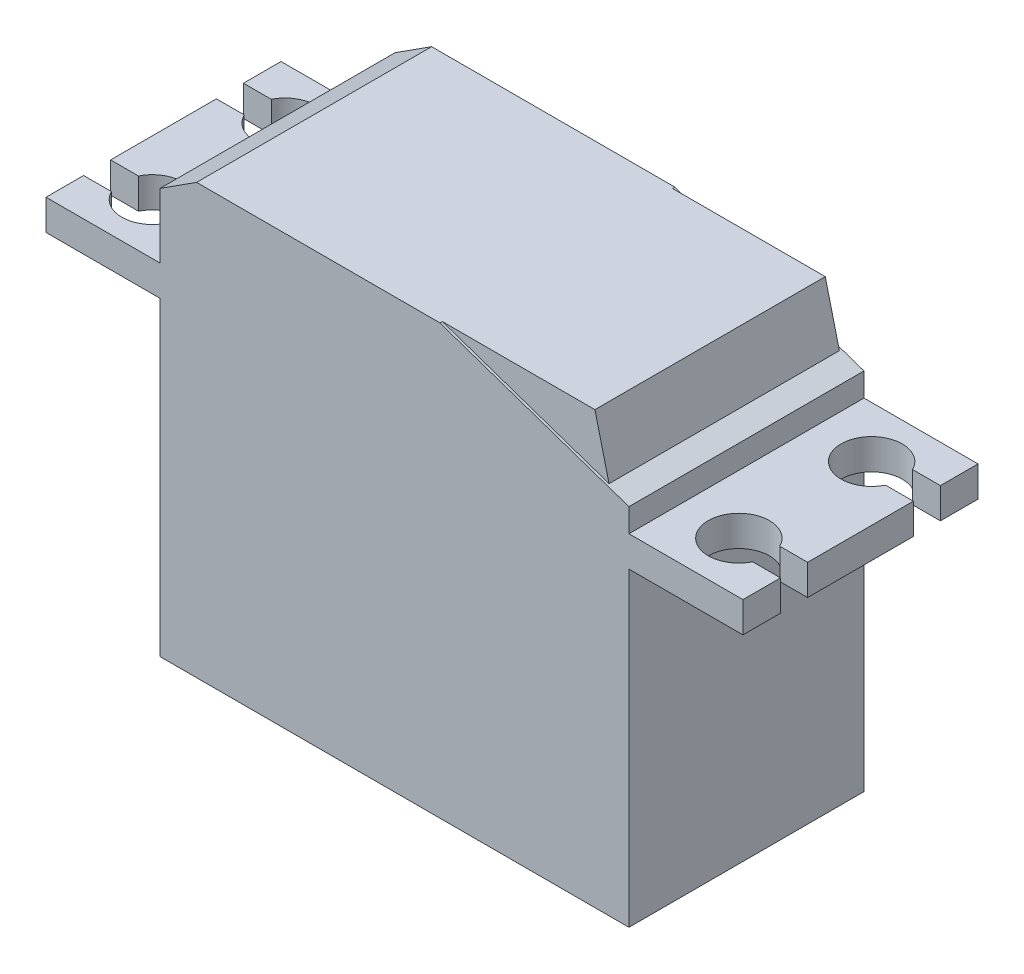
ISO-10303-21;
HEADER;
FILE_DESCRIPTION(('STEP AP214'),'2;1');
FILE_NAME('part.step','',(''),(''),'','','');
FILE_SCHEMA(('AUTOMOTIVE_DESIGN { 1 0 10303 214 1 1 1 1 }'));
ENDSEC;
DATA;
#1=APPLICATION_CONTEXT('core data for automotive mechanical design processes');
#2=APPLICATION_PROTOCOL_DEFINITION('international standard','automotive_design',2000,#1);
#3=PRODUCT_CONTEXT('',#1,'mechanical');
#4=PRODUCT('Part','Part','',(#3));
#5=PRODUCT_RELATED_PRODUCT_CATEGORY('part','',(#4));
#6=PRODUCT_DEFINITION_FORMATION('','',#4);
#7=PRODUCT_DEFINITION_CONTEXT('part definition',#1,'design');
#8=PRODUCT_DEFINITION('design','',#6,#7);
#9=PRODUCT_DEFINITION_SHAPE('','',#8);
#10=(LENGTH_UNIT() NAMED_UNIT(*) SI_UNIT(.MILLI.,.METRE.));
#11=(NAMED_UNIT(*) PLANE_ANGLE_UNIT() SI_UNIT($,.RADIAN.));
#12=(NAMED_UNIT(*) SI_UNIT($,.STERADIAN.) SOLID_ANGLE_UNIT());
#13=UNCERTAINTY_MEASURE_WITH_UNIT(LENGTH_MEASURE(1.E-05),#10,'distance_accuracy_value','');
#14=(GEOMETRIC_REPRESENTATION_CONTEXT(3) GLOBAL_UNCERTAINTY_ASSIGNED_CONTEXT((#13)) GLOBAL_UNIT_ASSIGNED_CONTEXT((#10,
#11,#12)) REPRESENTATION_CONTEXT('',''));
#15=CARTESIAN_POINT('',(0.,0.,0.));
#16=DIRECTION('',(0.,0.,1.));
#17=DIRECTION('',(1.,0.,0.));
#18=AXIS2_PLACEMENT_3D('',#15,#16,#17);
#19=CARTESIAN_POINT('',(-29.65,10.75,10.));
#20=DIRECTION('',(0.,1.,0.));
#21=DIRECTION('',(0.,0.,1.));
#22=AXIS2_PLACEMENT_3D('',#19,#20,#21);
#23=PLANE('',#22);
#24=DIRECTION('',(0.,0.,1.));
#25=VECTOR('',#24,1.);
#26=CARTESIAN_POINT('',(-29.65,10.75,10.));
#27=LINE('',#26,#25);
#28=CARTESIAN_POINT('',(-29.65,10.75,-10.));
#29=VERTEX_POINT('',#28);
#30=CARTESIAN_POINT('',(-29.65,10.75,-6.8));
#31=VERTEX_POINT('',#30);
#32=EDGE_CURVE('E271',#29,#31,#27,.T.);
#33=ORIENTED_EDGE('',*,*,#32,.T.);
#34=DIRECTION('',(1.,0.,0.));
#35=VECTOR('',#34,1.);
#36=CARTESIAN_POINT('',(-29.65,10.75,-6.8));
#37=LINE('',#36,#35);
#38=CARTESIAN_POINT('',(-27.2818447632722,10.75,-6.8));
#39=VERTEX_POINT('',#38);
#40=EDGE_CURVE('E256',#31,#39,#37,.T.);
#41=ORIENTED_EDGE('',*,*,#40,.T.);
#42=CARTESIAN_POINT('',(-24.95,10.75,-5.65));
#43=DIRECTION('',(0.,-1.,0.));
#44=DIRECTION('',(0.,0.,1.));
#45=AXIS2_PLACEMENT_3D('',#42,#43,#44);
#46=CIRCLE('',#45,2.6);
#47=CARTESIAN_POINT('',(-27.2818447632722,10.75,-4.5));
#48=VERTEX_POINT('',#47);
#49=EDGE_CURVE('E265',#39,#48,#46,.T.);
#50=ORIENTED_EDGE('',*,*,#49,.T.);
#51=DIRECTION('',(-1.,0.,0.));
#52=VECTOR('',#51,1.);
#53=CARTESIAN_POINT('',(-29.65,10.75,-4.5));
#54=LINE('',#53,#52);
#55=CARTESIAN_POINT('',(-29.65,10.75,-4.5));
#56=VERTEX_POINT('',#55);
#57=EDGE_CURVE('E249',#48,#56,#54,.T.);
#58=ORIENTED_EDGE('',*,*,#57,.T.);
#59=CARTESIAN_POINT('',(-29.65,10.75,4.5));
#60=VERTEX_POINT('',#59);
#61=EDGE_CURVE('E261',#56,#60,#27,.T.);
#62=ORIENTED_EDGE('',*,*,#61,.T.);
#63=DIRECTION('',(1.,0.,0.));
#64=VECTOR('',#63,1.);
#65=CARTESIAN_POINT('',(-29.65,10.75,4.5));
#66=LINE('',#65,#64);
#67=CARTESIAN_POINT('',(-27.2818447632722,10.75,4.5));
#68=VERTEX_POINT('',#67);
#69=EDGE_CURVE('E594',#60,#68,#66,.T.);
#70=ORIENTED_EDGE('',*,*,#69,.T.);
#71=CARTESIAN_POINT('',(-24.95,10.75,5.65));
#72=DIRECTION('',(0.,-1.,0.));
#73=DIRECTION('',(0.,0.,-1.));
#74=AXIS2_PLACEMENT_3D('',#71,#72,#73);
#75=CIRCLE('',#74,2.6);
#76=CARTESIAN_POINT('',(-27.2818447632722,10.75,6.8));
#77=VERTEX_POINT('',#76);
#78=EDGE_CURVE('E598',#68,#77,#75,.T.);
#79=ORIENTED_EDGE('',*,*,#78,.T.);
#80=DIRECTION('',(-1.,0.,0.));
#81=VECTOR('',#80,1.);
#82=CARTESIAN_POINT('',(-29.65,10.75,6.8));
#83=LINE('',#82,#81);
#84=CARTESIAN_POINT('',(-29.65,10.75,6.8));
#85=VERTEX_POINT('',#84);
#86=EDGE_CURVE('E601',#77,#85,#83,.T.);
#87=ORIENTED_EDGE('',*,*,#86,.T.);
#88=CARTESIAN_POINT('',(-29.65,10.75,10.));
#89=VERTEX_POINT('',#88);
#90=EDGE_CURVE('E272',#85,#89,#27,.T.);
#91=ORIENTED_EDGE('',*,*,#90,.T.);
#92=DIRECTION('',(1.,0.,0.));
#93=VECTOR('',#92,1.);
#94=CARTESIAN_POINT('',(-29.65,10.75,10.));
#95=LINE('',#94,#93);
#96=CARTESIAN_POINT('',(-19.95,10.75,10.));
#97=VERTEX_POINT('',#96);
#98=EDGE_CURVE('E300',#89,#97,#95,.T.);
#99=ORIENTED_EDGE('',*,*,#98,.T.);
#100=DIRECTION('',(0.,0.,1.));
#101=VECTOR('',#100,1.);
#102=CARTESIAN_POINT('',(-19.95,10.75,10.));
#103=LINE('',#102,#101);
#104=CARTESIAN_POINT('',(-19.95,10.75,-10.));
#105=VERTEX_POINT('',#104);
#106=EDGE_CURVE('E292',#105,#97,#103,.T.);
#107=ORIENTED_EDGE('',*,*,#106,.F.);
#108=DIRECTION('',(1.,0.,0.));
#109=VECTOR('',#108,1.);
#110=CARTESIAN_POINT('',(-29.65,10.75,-10.));
#111=LINE('',#110,#109);
#112=EDGE_CURVE('E303',#29,#105,#111,.T.);
#113=ORIENTED_EDGE('',*,*,#112,.F.);
#114=EDGE_LOOP('',(#33,#41,#50,#58,#62,#70,#79,#87,#91,#99,#107,#113));
#115=FACE_BOUND('',#114,.T.);
#116=ADVANCED_FACE('F32',(#115),#23,.T.);
#117=CARTESIAN_POINT('',(-29.65,8.15,10.));
#118=DIRECTION('',(0.,-1.,0.));
#119=DIRECTION('',(0.,0.,-1.));
#120=AXIS2_PLACEMENT_3D('',#117,#118,#119);
#121=PLANE('',#120);
#122=CARTESIAN_POINT('',(-24.95,8.15,-5.65));
#123=DIRECTION('',(0.,-1.,0.));
#124=DIRECTION('',(0.,0.,-1.));
#125=AXIS2_PLACEMENT_3D('',#122,#123,#124);
#126=CIRCLE('',#125,2.6);
#127=CARTESIAN_POINT('',(-27.2818447632722,8.15,-6.8));
#128=VERTEX_POINT('',#127);
#129=CARTESIAN_POINT('',(-27.2818447632722,8.15,-4.5));
#130=VERTEX_POINT('',#129);
#131=EDGE_CURVE('E618',#128,#130,#126,.T.);
#132=ORIENTED_EDGE('',*,*,#131,.F.);
#133=DIRECTION('',(1.,0.,0.));
#134=VECTOR('',#133,1.);
#135=CARTESIAN_POINT('',(-29.65,8.15,-6.8));
#136=LINE('',#135,#134);
#137=CARTESIAN_POINT('',(-29.65,8.15,-6.8));
#138=VERTEX_POINT('',#137);
#139=EDGE_CURVE('E266',#138,#128,#136,.T.);
#140=ORIENTED_EDGE('',*,*,#139,.F.);
#141=DIRECTION('',(0.,0.,-1.));
#142=VECTOR('',#141,1.);
#143=CARTESIAN_POINT('',(-29.65,8.15,10.));
#144=LINE('',#143,#142);
#145=CARTESIAN_POINT('',(-29.65,8.15,-10.));
#146=VERTEX_POINT('',#145);
#147=EDGE_CURVE('E281',#138,#146,#144,.T.);
#148=ORIENTED_EDGE('',*,*,#147,.T.);
#149=DIRECTION('',(1.,0.,0.));
#150=VECTOR('',#149,1.);
#151=CARTESIAN_POINT('',(-29.65,8.15,-10.));
#152=LINE('',#151,#150);
#153=CARTESIAN_POINT('',(-19.95,8.15,-10.));
#154=VERTEX_POINT('',#153);
#155=EDGE_CURVE('E307',#146,#154,#152,.T.);
#156=ORIENTED_EDGE('',*,*,#155,.T.);
#157=DIRECTION('',(0.,0.,-1.));
#158=VECTOR('',#157,1.);
#159=CARTESIAN_POINT('',(-19.95,8.15,10.));
#160=LINE('',#159,#158);
#161=CARTESIAN_POINT('',(-19.95,8.15,10.));
#162=VERTEX_POINT('',#161);
#163=EDGE_CURVE('E296',#162,#154,#160,.T.);
#164=ORIENTED_EDGE('',*,*,#163,.F.);
#165=DIRECTION('',(1.,0.,0.));
#166=VECTOR('',#165,1.);
#167=CARTESIAN_POINT('',(-29.65,8.15,10.));
#168=LINE('',#167,#166);
#169=CARTESIAN_POINT('',(-29.65,8.15,10.));
#170=VERTEX_POINT('',#169);
#171=EDGE_CURVE('E285',#170,#162,#168,.T.);
#172=ORIENTED_EDGE('',*,*,#171,.F.);
#173=CARTESIAN_POINT('',(-29.65,8.15,6.8));
#174=VERTEX_POINT('',#173);
#175=EDGE_CURVE('E282',#170,#174,#144,.T.);
#176=ORIENTED_EDGE('',*,*,#175,.T.);
#177=DIRECTION('',(-1.,0.,0.));
#178=VECTOR('',#177,1.);
#179=CARTESIAN_POINT('',(-29.65,8.15,6.8));
#180=LINE('',#179,#178);
#181=CARTESIAN_POINT('',(-27.2818447632722,8.15,6.8));
#182=VERTEX_POINT('',#181);
#183=EDGE_CURVE('E57',#182,#174,#180,.T.);
#184=ORIENTED_EDGE('',*,*,#183,.F.);
#185=CARTESIAN_POINT('',(-24.95,8.15,5.65));
#186=DIRECTION('',(0.,-1.,0.));
#187=DIRECTION('',(0.,0.,-1.));
#188=AXIS2_PLACEMENT_3D('',#185,#186,#187);
#189=CIRCLE('',#188,2.6);
#190=CARTESIAN_POINT('',(-27.2818447632722,8.15,4.5));
#191=VERTEX_POINT('',#190);
#192=EDGE_CURVE('E588',#191,#182,#189,.T.);
#193=ORIENTED_EDGE('',*,*,#192,.F.);
#194=DIRECTION('',(1.,0.,0.));
#195=VECTOR('',#194,1.);
#196=CARTESIAN_POINT('',(-29.65,8.15,4.5));
#197=LINE('',#196,#195);
#198=CARTESIAN_POINT('',(-29.65,8.15,4.5));
#199=VERTEX_POINT('',#198);
#200=EDGE_CURVE('E603',#199,#191,#197,.T.);
#201=ORIENTED_EDGE('',*,*,#200,.F.);
#202=CARTESIAN_POINT('',(-29.65,8.15,-4.5));
#203=VERTEX_POINT('',#202);
#204=EDGE_CURVE('E286',#199,#203,#144,.T.);
#205=ORIENTED_EDGE('',*,*,#204,.T.);
#206=DIRECTION('',(-1.,0.,0.));
#207=VECTOR('',#206,1.);
#208=CARTESIAN_POINT('',(-29.65,8.15,-4.5));
#209=LINE('',#208,#207);
#210=EDGE_CURVE('E49',#130,#203,#209,.T.);
#211=ORIENTED_EDGE('',*,*,#210,.F.);
#212=EDGE_LOOP('',(#132,#140,#148,#156,#164,#172,#176,#184,#193,#201,#205,#211));
#213=FACE_BOUND('',#212,.T.);
#214=ADVANCED_FACE('F328',(#213),#121,.T.);
#215=CARTESIAN_POINT('',(-29.65,0.,0.));
#216=DIRECTION('',(-1.,0.,0.));
#217=DIRECTION('',(0.,0.,-1.));
#218=AXIS2_PLACEMENT_3D('',#215,#216,#217);
#219=PLANE('',#218);
#220=ORIENTED_EDGE('',*,*,#147,.F.);
#221=DIRECTION('',(0.,1.,0.));
#222=VECTOR('',#221,1.);
#223=CARTESIAN_POINT('',(-29.65,-18.251025,-6.8));
#224=LINE('',#223,#222);
#225=EDGE_CURVE('E607',#138,#31,#224,.T.);
#226=ORIENTED_EDGE('',*,*,#225,.T.);
#227=ORIENTED_EDGE('',*,*,#32,.F.);
#228=DIRECTION('',(0.,1.,0.));
#229=VECTOR('',#228,1.);
#230=CARTESIAN_POINT('',(-29.65,10.75,-10.));
#231=LINE('',#230,#229);
#232=EDGE_CURVE('E274',#146,#29,#231,.T.);
#233=ORIENTED_EDGE('',*,*,#232,.F.);
#234=EDGE_LOOP('',(#220,#226,#227,#233));
#235=FACE_BOUND('',#234,.T.);
#236=ADVANCED_FACE('F626',(#235),#219,.T.);
#237=ORIENTED_EDGE('',*,*,#61,.F.);
#238=DIRECTION('',(0.,1.,0.));
#239=VECTOR('',#238,1.);
#240=CARTESIAN_POINT('',(-29.65,-18.251025,-4.5));
#241=LINE('',#240,#239);
#242=EDGE_CURVE('E246',#203,#56,#241,.T.);
#243=ORIENTED_EDGE('',*,*,#242,.F.);
#244=ORIENTED_EDGE('',*,*,#204,.F.);
#245=DIRECTION('',(0.,1.,0.));
#246=VECTOR('',#245,1.);
#247=CARTESIAN_POINT('',(-29.65,-18.251025,4.5));
#248=LINE('',#247,#246);
#249=EDGE_CURVE('E270',#199,#60,#248,.T.);
#250=ORIENTED_EDGE('',*,*,#249,.T.);
#251=EDGE_LOOP('',(#237,#243,#244,#250));
#252=FACE_BOUND('',#251,.T.);
#253=ADVANCED_FACE('F269',(#252),#219,.T.);
#254=ORIENTED_EDGE('',*,*,#90,.F.);
#255=DIRECTION('',(0.,1.,0.));
#256=VECTOR('',#255,1.);
#257=CARTESIAN_POINT('',(-29.65,-18.251025,6.8));
#258=LINE('',#257,#256);
#259=EDGE_CURVE('E584',#174,#85,#258,.T.);
#260=ORIENTED_EDGE('',*,*,#259,.F.);
#261=ORIENTED_EDGE('',*,*,#175,.F.);
#262=DIRECTION('',(0.,-1.,0.));
#263=VECTOR('',#262,1.);
#264=CARTESIAN_POINT('',(-29.65,10.75,10.));
#265=LINE('',#264,#263);
#266=EDGE_CURVE('E275',#89,#170,#265,.T.);
#267=ORIENTED_EDGE('',*,*,#266,.F.);
#268=EDGE_LOOP('',(#254,#260,#261,#267));
#269=FACE_BOUND('',#268,.T.);
#270=ADVANCED_FACE('F583',(#269),#219,.T.);
#271=CARTESIAN_POINT('',(-19.95,18.25,-10.));
#272=DIRECTION('',(1.,0.,0.));
#273=DIRECTION('',(0.,0.,-1.));
#274=AXIS2_PLACEMENT_3D('',#271,#272,#273);
#275=PLANE('',#274);
#276=DIRECTION('',(0.,-1.,0.));
#277=VECTOR('',#276,1.);
#278=CARTESIAN_POINT('',(-19.95,18.25,10.));
#279=LINE('',#278,#277);
#280=CARTESIAN_POINT('',(-19.95,-18.25,10.));
#281=VERTEX_POINT('',#280);
#282=EDGE_CURVE('E321',#162,#281,#279,.T.);
#283=ORIENTED_EDGE('',*,*,#282,.F.);
#284=ORIENTED_EDGE('',*,*,#163,.T.);
#285=DIRECTION('',(0.,-1.,0.));
#286=VECTOR('',#285,1.);
#287=CARTESIAN_POINT('',(-19.95,18.25,-10.));
#288=LINE('',#287,#286);
#289=CARTESIAN_POINT('',(-19.95,-18.25,-10.));
#290=VERTEX_POINT('',#289);
#291=EDGE_CURVE('E297',#154,#290,#288,.T.);
#292=ORIENTED_EDGE('',*,*,#291,.T.);
#293=DIRECTION('',(0.,0.,1.));
#294=VECTOR('',#293,1.);
#295=CARTESIAN_POINT('',(-19.95,-18.25,-10.));
#296=LINE('',#295,#294);
#297=EDGE_CURVE('E334',#290,#281,#296,.T.);
#298=ORIENTED_EDGE('',*,*,#297,.T.);
#299=EDGE_LOOP('',(#283,#284,#292,#298));
#300=FACE_BOUND('',#299,.T.);
#301=ADVANCED_FACE('F332',(#300),#275,.F.);
#302=CARTESIAN_POINT('',(16.8538354227075,18.25,-9.8));
#303=DIRECTION('',(0.970588235294116,0.24074566976096,0.));
#304=DIRECTION('',(-0.24074566976096,0.970588235294116,0.));
#305=AXIS2_PLACEMENT_3D('',#302,#303,#304);
#306=PLANE('',#305);
#307=DIRECTION('',(0.,0.,1.));
#308=VECTOR('',#307,1.);
#309=CARTESIAN_POINT('',(16.8538354227075,18.25,-9.8));
#310=LINE('',#309,#308);
#311=CARTESIAN_POINT('',(16.8538354227075,18.25,-9.8));
#312=VERTEX_POINT('',#311);
#313=CARTESIAN_POINT('',(16.8538354227075,18.25,9.8));
#314=VERTEX_POINT('',#313);
#315=EDGE_CURVE('E489',#312,#314,#310,.T.);
#316=ORIENTED_EDGE('',*,*,#315,.T.);
#317=DIRECTION('',(-0.24074566976096,0.970588235294116,0.));
#318=VECTOR('',#317,1.);
#319=CARTESIAN_POINT('',(18.0575637715123,13.3970588235294,9.8));
#320=LINE('',#319,#318);
#321=CARTESIAN_POINT('',(18.0575637715123,13.3970588235294,9.79999999999999));
#322=VERTEX_POINT('',#321);
#323=EDGE_CURVE('E571',#322,#314,#320,.T.);
#324=ORIENTED_EDGE('',*,*,#323,.F.);
#325=DIRECTION('',(0.,0.,1.));
#326=VECTOR('',#325,1.);
#327=CARTESIAN_POINT('',(18.0575637715123,13.3970588235294,-9.8));
#328=LINE('',#327,#326);
#329=CARTESIAN_POINT('',(18.0575637715123,13.3970588235294,-9.8));
#330=VERTEX_POINT('',#329);
#331=EDGE_CURVE('E488',#330,#322,#328,.T.);
#332=ORIENTED_EDGE('',*,*,#331,.F.);
#333=DIRECTION('',(-0.24074566976096,0.970588235294116,0.));
#334=VECTOR('',#333,1.);
#335=CARTESIAN_POINT('',(16.8538354227075,18.25,-9.8));
#336=LINE('',#335,#334);
#337=EDGE_CURVE('E482',#330,#312,#336,.T.);
#338=ORIENTED_EDGE('',*,*,#337,.T.);
#339=EDGE_LOOP('',(#316,#324,#332,#338));
#340=FACE_BOUND('',#339,.T.);
#341=ADVANCED_FACE('F679',(#340),#306,.T.);
#342=CARTESIAN_POINT('',(29.65,0.,0.));
#343=DIRECTION('',(1.,0.,0.));
#344=DIRECTION('',(0.,0.,-1.));
#345=AXIS2_PLACEMENT_3D('',#342,#343,#344);
#346=PLANE('',#345);
#347=DIRECTION('',(0.,1.,0.));
#348=VECTOR('',#347,1.);
#349=CARTESIAN_POINT('',(29.65,-18.251025,-4.5));
#350=LINE('',#349,#348);
#351=CARTESIAN_POINT('',(29.65,8.15,-4.5));
#352=VERTEX_POINT('',#351);
#353=CARTESIAN_POINT('',(29.65,10.75,-4.5));
#354=VERTEX_POINT('',#353);
#355=EDGE_CURVE('E452',#352,#354,#350,.T.);
#356=ORIENTED_EDGE('',*,*,#355,.T.);
#357=DIRECTION('',(0.,0.,1.));
#358=VECTOR('',#357,1.);
#359=CARTESIAN_POINT('',(29.65,10.75,10.));
#360=LINE('',#359,#358);
#361=CARTESIAN_POINT('',(29.65,10.75,4.5));
#362=VERTEX_POINT('',#361);
#363=EDGE_CURVE('E388',#354,#362,#360,.T.);
#364=ORIENTED_EDGE('',*,*,#363,.T.);
#365=DIRECTION('',(0.,1.,0.));
#366=VECTOR('',#365,1.);
#367=CARTESIAN_POINT('',(29.65,-18.251025,4.5));
#368=LINE('',#367,#366);
#369=CARTESIAN_POINT('',(29.65,8.15,4.5));
#370=VERTEX_POINT('',#369);
#371=EDGE_CURVE('E450',#370,#362,#368,.T.);
#372=ORIENTED_EDGE('',*,*,#371,.F.);
#373=DIRECTION('',(0.,0.,-1.));
#374=VECTOR('',#373,1.);
#375=CARTESIAN_POINT('',(29.65,8.15,10.));
#376=LINE('',#375,#374);
#377=EDGE_CURVE('E381',#370,#352,#376,.T.);
#378=ORIENTED_EDGE('',*,*,#377,.T.);
#379=EDGE_LOOP('',(#356,#364,#372,#378));
#380=FACE_BOUND('',#379,.T.);
#381=ADVANCED_FACE('F448',(#380),#346,.T.);
#382=DIRECTION('',(0.,1.,0.));
#383=VECTOR('',#382,1.);
#384=CARTESIAN_POINT('',(29.65,-18.251025,6.8));
#385=LINE('',#384,#383);
#386=CARTESIAN_POINT('',(29.65,8.15,6.8));
#387=VERTEX_POINT('',#386);
#388=CARTESIAN_POINT('',(29.65,10.75,6.8));
#389=VERTEX_POINT('',#388);
#390=EDGE_CURVE('E474',#387,#389,#385,.T.);
#391=ORIENTED_EDGE('',*,*,#390,.T.);
#392=CARTESIAN_POINT('',(29.65,10.75,10.));
#393=VERTEX_POINT('',#392);
#394=EDGE_CURVE('E383',#389,#393,#360,.T.);
#395=ORIENTED_EDGE('',*,*,#394,.T.);
#396=DIRECTION('',(0.,-1.,0.));
#397=VECTOR('',#396,1.);
#398=CARTESIAN_POINT('',(29.65,10.75,10.));
#399=LINE('',#398,#397);
#400=CARTESIAN_POINT('',(29.65,8.15,10.));
#401=VERTEX_POINT('',#400);
#402=EDGE_CURVE('E372',#393,#401,#399,.T.);
#403=ORIENTED_EDGE('',*,*,#402,.T.);
#404=EDGE_CURVE('E377',#401,#387,#376,.T.);
#405=ORIENTED_EDGE('',*,*,#404,.T.);
#406=EDGE_LOOP('',(#391,#395,#403,#405));
#407=FACE_BOUND('',#406,.T.);
#408=ADVANCED_FACE('F687',(#407),#346,.T.);
#409=CARTESIAN_POINT('',(19.95,18.25,-10.));
#410=DIRECTION('',(-1.,0.,0.));
#411=DIRECTION('',(0.,0.,1.));
#412=AXIS2_PLACEMENT_3D('',#409,#410,#411);
#413=PLANE('',#412);
#414=DIRECTION('',(0.,-1.,0.));
#415=VECTOR('',#414,1.);
#416=CARTESIAN_POINT('',(19.95,18.25,-10.));
#417=LINE('',#416,#415);
#418=CARTESIAN_POINT('',(19.95,12.75,-10.));
#419=VERTEX_POINT('',#418);
#420=CARTESIAN_POINT('',(19.95,10.75,-10.));
#421=VERTEX_POINT('',#420);
#422=EDGE_CURVE('E41',#419,#421,#417,.T.);
#423=ORIENTED_EDGE('',*,*,#422,.F.);
#424=DIRECTION('',(0.,0.,1.));
#425=VECTOR('',#424,1.);
#426=CARTESIAN_POINT('',(19.95,12.75,-10.00005));
#427=LINE('',#426,#425);
#428=CARTESIAN_POINT('',(19.95,12.75,10.));
#429=VERTEX_POINT('',#428);
#430=EDGE_CURVE('E370',#419,#429,#427,.T.);
#431=ORIENTED_EDGE('',*,*,#430,.T.);
#432=DIRECTION('',(0.,-1.,0.));
#433=VECTOR('',#432,1.);
#434=CARTESIAN_POINT('',(19.95,18.25,10.));
#435=LINE('',#434,#433);
#436=CARTESIAN_POINT('',(19.95,10.75,10.));
#437=VERTEX_POINT('',#436);
#438=EDGE_CURVE('E337',#429,#437,#435,.T.);
#439=ORIENTED_EDGE('',*,*,#438,.T.);
#440=DIRECTION('',(0.,0.,1.));
#441=VECTOR('',#440,1.);
#442=CARTESIAN_POINT('',(19.95,10.75,10.));
#443=LINE('',#442,#441);
#444=EDGE_CURVE('E376',#421,#437,#443,.T.);
#445=ORIENTED_EDGE('',*,*,#444,.F.);
#446=EDGE_LOOP('',(#423,#431,#439,#445));
#447=FACE_BOUND('',#446,.T.);
#448=ADVANCED_FACE('F34',(#447),#413,.F.);
#449=DIRECTION('',(0.,0.,-1.));
#450=VECTOR('',#449,1.);
#451=CARTESIAN_POINT('',(19.95,8.15,10.));
#452=LINE('',#451,#450);
#453=CARTESIAN_POINT('',(19.95,8.15,10.));
#454=VERTEX_POINT('',#453);
#455=CARTESIAN_POINT('',(19.95,8.15,-10.));
#456=VERTEX_POINT('',#455);
#457=EDGE_CURVE('E369',#454,#456,#452,.T.);
#458=ORIENTED_EDGE('',*,*,#457,.F.);
#459=CARTESIAN_POINT('',(19.95,-18.25,10.));
#460=VERTEX_POINT('',#459);
#461=EDGE_CURVE('E341',#454,#460,#435,.T.);
#462=ORIENTED_EDGE('',*,*,#461,.T.);
#463=DIRECTION('',(0.,0.,-1.));
#464=VECTOR('',#463,1.);
#465=CARTESIAN_POINT('',(19.95,-18.25,-10.));
#466=LINE('',#465,#464);
#467=CARTESIAN_POINT('',(19.95,-18.25,-10.));
#468=VERTEX_POINT('',#467);
#469=EDGE_CURVE('E405',#460,#468,#466,.T.);
#470=ORIENTED_EDGE('',*,*,#469,.T.);
#471=EDGE_CURVE('E356',#456,#468,#417,.T.);
#472=ORIENTED_EDGE('',*,*,#471,.F.);
#473=EDGE_LOOP('',(#458,#462,#470,#472));
#474=FACE_BOUND('',#473,.T.);
#475=ADVANCED_FACE('F552',(#474),#413,.F.);
#476=CARTESIAN_POINT('',(-19.95,18.25,-10.));
#477=DIRECTION('',(0.,0.,1.));
#478=DIRECTION('',(1.,0.,0.));
#479=AXIS2_PLACEMENT_3D('',#476,#477,#478);
#480=PLANE('',#479);
#481=CARTESIAN_POINT('',(-19.95,16.25,-10.));
#482=VERTEX_POINT('',#481);
#483=EDGE_CURVE('E345',#482,#105,#288,.T.);
#484=ORIENTED_EDGE('',*,*,#483,.F.);
#485=DIRECTION('',(-0.841317968447209,-0.540540540540541,0.));
#486=VECTOR('',#485,1.);
#487=CARTESIAN_POINT('',(-16.8371235167453,18.25,-10.));
#488=LINE('',#487,#486);
#489=CARTESIAN_POINT('',(-16.8371235167453,18.25,-10.));
#490=VERTEX_POINT('',#489);
#491=EDGE_CURVE('E302',#490,#482,#488,.T.);
#492=ORIENTED_EDGE('',*,*,#491,.F.);
#493=DIRECTION('',(-1.,0.,0.));
#494=VECTOR('',#493,1.);
#495=CARTESIAN_POINT('',(-19.95,18.25,-10.));
#496=LINE('',#495,#494);
#497=CARTESIAN_POINT('',(3.86429205785458,18.25,-10.0000025));
#498=VERTEX_POINT('',#497);
#499=EDGE_CURVE('E559',#498,#490,#496,.T.);
#500=ORIENTED_EDGE('',*,*,#499,.F.);
#501=DIRECTION('',(0.946218114243848,-0.323529411764706,0.));
#502=VECTOR('',#501,1.);
#503=CARTESIAN_POINT('',(-17.4573275614183,25.5402546986291,-10.));
#504=LINE('',#503,#502);
#505=EDGE_CURVE('E365',#498,#419,#504,.T.);
#506=ORIENTED_EDGE('',*,*,#505,.T.);
#507=ORIENTED_EDGE('',*,*,#422,.T.);
#508=DIRECTION('',(-1.,0.,0.));
#509=VECTOR('',#508,1.);
#510=CARTESIAN_POINT('',(29.65,10.75,-10.));
#511=LINE('',#510,#509);
#512=CARTESIAN_POINT('',(29.65,10.75,-10.));
#513=VERTEX_POINT('',#512);
#514=EDGE_CURVE('E400',#513,#421,#511,.T.);
#515=ORIENTED_EDGE('',*,*,#514,.F.);
#516=DIRECTION('',(0.,1.,0.));
#517=VECTOR('',#516,1.);
#518=CARTESIAN_POINT('',(29.65,10.75,-10.));
#519=LINE('',#518,#517);
#520=CARTESIAN_POINT('',(29.65,8.15,-10.));
#521=VERTEX_POINT('',#520);
#522=EDGE_CURVE('E380',#521,#513,#519,.T.);
#523=ORIENTED_EDGE('',*,*,#522,.F.);
#524=DIRECTION('',(-1.,0.,0.));
#525=VECTOR('',#524,1.);
#526=CARTESIAN_POINT('',(29.65,8.15,-10.));
#527=LINE('',#526,#525);
#528=EDGE_CURVE('E396',#521,#456,#527,.T.);
#529=ORIENTED_EDGE('',*,*,#528,.T.);
#530=ORIENTED_EDGE('',*,*,#471,.T.);
#531=DIRECTION('',(-1.,0.,0.));
#532=VECTOR('',#531,1.);
#533=CARTESIAN_POINT('',(-19.95,-18.25,-10.));
#534=LINE('',#533,#532);
#535=EDGE_CURVE('E545',#468,#290,#534,.T.);
#536=ORIENTED_EDGE('',*,*,#535,.T.);
#537=ORIENTED_EDGE('',*,*,#291,.F.);
#538=ORIENTED_EDGE('',*,*,#155,.F.);
#539=ORIENTED_EDGE('',*,*,#232,.T.);
#540=ORIENTED_EDGE('',*,*,#112,.T.);
#541=EDGE_LOOP('',(#484,#492,#500,#506,#507,#515,#523,#529,#530,#536,#537,#538,#539,#540));
#542=FACE_BOUND('',#541,.T.);
#543=ADVANCED_FACE('F427',(#542),#480,.F.);
#544=ORIENTED_EDGE('',*,*,#483,.T.);
#545=ORIENTED_EDGE('',*,*,#106,.T.);
#546=CARTESIAN_POINT('',(-19.95,16.25,10.));
#547=VERTEX_POINT('',#546);
#548=EDGE_CURVE('E336',#547,#97,#279,.T.);
#549=ORIENTED_EDGE('',*,*,#548,.F.);
#550=DIRECTION('',(0.,0.,-1.));
#551=VECTOR('',#550,1.);
#552=CARTESIAN_POINT('',(-19.95,16.25,10.00105));
#553=LINE('',#552,#551);
#554=EDGE_CURVE('E572',#547,#482,#553,.T.);
#555=ORIENTED_EDGE('',*,*,#554,.T.);
#556=EDGE_LOOP('',(#544,#545,#549,#555));
#557=FACE_BOUND('',#556,.T.);
#558=ADVANCED_FACE('F577',(#557),#275,.F.);
#559=CARTESIAN_POINT('',(-19.95,18.25,10.));
#560=DIRECTION('',(0.,0.,-1.));
#561=DIRECTION('',(-1.,0.,0.));
#562=AXIS2_PLACEMENT_3D('',#559,#560,#561);
#563=PLANE('',#562);
#564=DIRECTION('',(1.,0.,0.));
#565=VECTOR('',#564,1.);
#566=CARTESIAN_POINT('',(-19.95,18.25,10.));
#567=LINE('',#566,#565);
#568=CARTESIAN_POINT('',(-16.8371235167453,18.25,10.));
#569=VERTEX_POINT('',#568);
#570=CARTESIAN_POINT('',(3.86429205785457,18.25,10.));
#571=VERTEX_POINT('',#570);
#572=EDGE_CURVE('E556',#569,#571,#567,.T.);
#573=ORIENTED_EDGE('',*,*,#572,.F.);
#574=DIRECTION('',(0.84131796844721,0.540540540540541,0.));
#575=VECTOR('',#574,1.);
#576=CARTESIAN_POINT('',(-16.8371235167453,18.25,10.));
#577=LINE('',#576,#575);
#578=EDGE_CURVE('E568',#547,#569,#577,.T.);
#579=ORIENTED_EDGE('',*,*,#578,.F.);
#580=ORIENTED_EDGE('',*,*,#548,.T.);
#581=ORIENTED_EDGE('',*,*,#98,.F.);
#582=ORIENTED_EDGE('',*,*,#266,.T.);
#583=ORIENTED_EDGE('',*,*,#171,.T.);
#584=ORIENTED_EDGE('',*,*,#282,.T.);
#585=DIRECTION('',(1.,0.,0.));
#586=VECTOR('',#585,1.);
#587=CARTESIAN_POINT('',(-19.95,-18.25,10.));
#588=LINE('',#587,#586);
#589=EDGE_CURVE('E558',#281,#460,#588,.T.);
#590=ORIENTED_EDGE('',*,*,#589,.T.);
#591=ORIENTED_EDGE('',*,*,#461,.F.);
#592=DIRECTION('',(-1.,0.,0.));
#593=VECTOR('',#592,1.);
#594=CARTESIAN_POINT('',(29.65,8.15,10.));
#595=LINE('',#594,#593);
#596=EDGE_CURVE('E399',#401,#454,#595,.T.);
#597=ORIENTED_EDGE('',*,*,#596,.F.);
#598=ORIENTED_EDGE('',*,*,#402,.F.);
#599=DIRECTION('',(-1.,0.,0.));
#600=VECTOR('',#599,1.);
#601=CARTESIAN_POINT('',(29.65,10.75,10.));
#602=LINE('',#601,#600);
#603=EDGE_CURVE('E387',#393,#437,#602,.T.);
#604=ORIENTED_EDGE('',*,*,#603,.T.);
#605=ORIENTED_EDGE('',*,*,#438,.F.);
#606=DIRECTION('',(0.946218114243848,-0.323529411764706,0.));
#607=VECTOR('',#606,1.);
#608=CARTESIAN_POINT('',(19.95,12.75,10.));
#609=LINE('',#608,#607);
#610=EDGE_CURVE('E434',#571,#429,#609,.T.);
#611=ORIENTED_EDGE('',*,*,#610,.F.);
#612=EDGE_LOOP('',(#573,#579,#580,#581,#582,#583,#584,#590,#591,#597,#598,#604,#605,#611));
#613=FACE_BOUND('',#612,.T.);
#614=ADVANCED_FACE('F318',(#613),#563,.F.);
#615=CARTESIAN_POINT('',(0.,18.25,0.));
#616=DIRECTION('',(0.,1.,0.));
#617=DIRECTION('',(0.,0.,1.));
#618=AXIS2_PLACEMENT_3D('',#615,#616,#617);
#619=PLANE('',#618);
#620=DIRECTION('',(0.,0.,-1.));
#621=VECTOR('',#620,1.);
#622=CARTESIAN_POINT('',(-16.8371235167453,18.25,10.00105));
#623=LINE('',#622,#621);
#624=EDGE_CURVE('E566',#569,#490,#623,.T.);
#625=ORIENTED_EDGE('',*,*,#624,.F.);
#626=ORIENTED_EDGE('',*,*,#572,.T.);
#627=DIRECTION('',(0.,0.,1.));
#628=VECTOR('',#627,1.);
#629=CARTESIAN_POINT('',(3.86429205785457,18.25,9.8));
#630=LINE('',#629,#628);
#631=CARTESIAN_POINT('',(3.86429205785457,18.25,9.8));
#632=VERTEX_POINT('',#631);
#633=EDGE_CURVE('E497',#632,#571,#630,.T.);
#634=ORIENTED_EDGE('',*,*,#633,.F.);
#635=DIRECTION('',(-1.,0.,0.));
#636=VECTOR('',#635,1.);
#637=CARTESIAN_POINT('',(16.8538354227075,18.25,9.8));
#638=LINE('',#637,#636);
#639=EDGE_CURVE('E506',#314,#632,#638,.T.);
#640=ORIENTED_EDGE('',*,*,#639,.F.);
#641=ORIENTED_EDGE('',*,*,#315,.F.);
#642=DIRECTION('',(-1.,0.,0.));
#643=VECTOR('',#642,1.);
#644=CARTESIAN_POINT('',(3.86429205785459,18.25,-9.8));
#645=LINE('',#644,#643);
#646=CARTESIAN_POINT('',(3.86429205785457,18.25,-9.8));
#647=VERTEX_POINT('',#646);
#648=EDGE_CURVE('E485',#312,#647,#645,.T.);
#649=ORIENTED_EDGE('',*,*,#648,.T.);
#650=DIRECTION('',(0.,0.,1.));
#651=VECTOR('',#650,1.);
#652=CARTESIAN_POINT('',(3.86429205785458,18.25,0.));
#653=LINE('',#652,#651);
#654=EDGE_CURVE('E11',#498,#647,#653,.T.);
#655=ORIENTED_EDGE('',*,*,#654,.F.);
#656=ORIENTED_EDGE('',*,*,#499,.T.);
#657=EDGE_LOOP('',(#625,#626,#634,#640,#641,#649,#655,#656));
#658=FACE_BOUND('',#657,.T.);
#659=ADVANCED_FACE('F565',(#658),#619,.T.);
#660=CARTESIAN_POINT('',(0.,-18.25,0.));
#661=DIRECTION('',(0.,1.,0.));
#662=DIRECTION('',(0.,0.,1.));
#663=AXIS2_PLACEMENT_3D('',#660,#661,#662);
#664=PLANE('',#663);
#665=ORIENTED_EDGE('',*,*,#469,.F.);
#666=ORIENTED_EDGE('',*,*,#589,.F.);
#667=ORIENTED_EDGE('',*,*,#297,.F.);
#668=ORIENTED_EDGE('',*,*,#535,.F.);
#669=EDGE_LOOP('',(#665,#666,#667,#668));
#670=FACE_BOUND('',#669,.T.);
#671=ADVANCED_FACE('F550',(#670),#664,.F.);
#672=CARTESIAN_POINT('',(29.65,8.15,10.));
#673=DIRECTION('',(0.,1.,0.));
#674=DIRECTION('',(0.,0.,1.));
#675=AXIS2_PLACEMENT_3D('',#672,#673,#674);
#676=PLANE('',#675);
#677=CARTESIAN_POINT('',(24.95,8.15,-5.65));
#678=DIRECTION('',(0.,1.,0.));
#679=DIRECTION('',(0.,0.,1.));
#680=AXIS2_PLACEMENT_3D('',#677,#678,#679);
#681=CIRCLE('',#680,2.6);
#682=CARTESIAN_POINT('',(27.2818447632722,8.15,-4.5));
#683=VERTEX_POINT('',#682);
#684=CARTESIAN_POINT('',(27.2818447632722,8.15,-6.8));
#685=VERTEX_POINT('',#684);
#686=EDGE_CURVE('E501',#683,#685,#681,.F.);
#687=ORIENTED_EDGE('',*,*,#686,.F.);
#688=DIRECTION('',(-1.,0.,0.));
#689=VECTOR('',#688,1.);
#690=CARTESIAN_POINT('',(29.65,8.15,-4.5));
#691=LINE('',#690,#689);
#692=EDGE_CURVE('E504',#352,#683,#691,.T.);
#693=ORIENTED_EDGE('',*,*,#692,.F.);
#694=ORIENTED_EDGE('',*,*,#377,.F.);
#695=DIRECTION('',(1.,0.,0.));
#696=VECTOR('',#695,1.);
#697=CARTESIAN_POINT('',(29.65,8.15,4.5));
#698=LINE('',#697,#696);
#699=CARTESIAN_POINT('',(27.2818447632722,8.15,4.5));
#700=VERTEX_POINT('',#699);
#701=EDGE_CURVE('E460',#700,#370,#698,.T.);
#702=ORIENTED_EDGE('',*,*,#701,.F.);
#703=CARTESIAN_POINT('',(24.95,8.15,5.65));
#704=DIRECTION('',(0.,1.,0.));
#705=DIRECTION('',(0.,0.,1.));
#706=AXIS2_PLACEMENT_3D('',#703,#704,#705);
#707=CIRCLE('',#706,2.6);
#708=CARTESIAN_POINT('',(27.2818447632722,8.15,6.8));
#709=VERTEX_POINT('',#708);
#710=EDGE_CURVE('E469',#709,#700,#707,.F.);
#711=ORIENTED_EDGE('',*,*,#710,.F.);
#712=DIRECTION('',(-1.,0.,0.));
#713=VECTOR('',#712,1.);
#714=CARTESIAN_POINT('',(29.65,8.15,6.8));
#715=LINE('',#714,#713);
#716=EDGE_CURVE('E465',#387,#709,#715,.T.);
#717=ORIENTED_EDGE('',*,*,#716,.F.);
#718=ORIENTED_EDGE('',*,*,#404,.F.);
#719=ORIENTED_EDGE('',*,*,#596,.T.);
#720=ORIENTED_EDGE('',*,*,#457,.T.);
#721=ORIENTED_EDGE('',*,*,#528,.F.);
#722=CARTESIAN_POINT('',(29.65,8.15,-6.8));
#723=VERTEX_POINT('',#722);
#724=EDGE_CURVE('E375',#723,#521,#376,.T.);
#725=ORIENTED_EDGE('',*,*,#724,.F.);
#726=DIRECTION('',(1.,0.,0.));
#727=VECTOR('',#726,1.);
#728=CARTESIAN_POINT('',(29.65,8.15,-6.8));
#729=LINE('',#728,#727);
#730=EDGE_CURVE('E522',#685,#723,#729,.T.);
#731=ORIENTED_EDGE('',*,*,#730,.F.);
#732=EDGE_LOOP('',(#687,#693,#694,#702,#711,#717,#718,#719,#720,#721,#725,#731));
#733=FACE_BOUND('',#732,.T.);
#734=ADVANCED_FACE('F535',(#733),#676,.F.);
#735=CARTESIAN_POINT('',(29.65,10.75,10.));
#736=DIRECTION('',(0.,-1.,0.));
#737=DIRECTION('',(0.,0.,-1.));
#738=AXIS2_PLACEMENT_3D('',#735,#736,#737);
#739=PLANE('',#738);
#740=ORIENTED_EDGE('',*,*,#363,.F.);
#741=DIRECTION('',(1.,0.,0.));
#742=VECTOR('',#741,1.);
#743=CARTESIAN_POINT('',(29.65,10.75,-4.5));
#744=LINE('',#743,#742);
#745=CARTESIAN_POINT('',(27.2818447632722,10.75,-4.5));
#746=VERTEX_POINT('',#745);
#747=EDGE_CURVE('E518',#746,#354,#744,.T.);
#748=ORIENTED_EDGE('',*,*,#747,.F.);
#749=CARTESIAN_POINT('',(24.95,10.75,-5.65));
#750=DIRECTION('',(0.,1.,0.));
#751=DIRECTION('',(0.,0.,1.));
#752=AXIS2_PLACEMENT_3D('',#749,#750,#751);
#753=CIRCLE('',#752,2.6);
#754=CARTESIAN_POINT('',(27.2818447632722,10.75,-6.8));
#755=VERTEX_POINT('',#754);
#756=EDGE_CURVE('E515',#755,#746,#753,.T.);
#757=ORIENTED_EDGE('',*,*,#756,.F.);
#758=DIRECTION('',(-1.,0.,0.));
#759=VECTOR('',#758,1.);
#760=CARTESIAN_POINT('',(29.65,10.75,-6.8));
#761=LINE('',#760,#759);
#762=CARTESIAN_POINT('',(29.65,10.75,-6.8));
#763=VERTEX_POINT('',#762);
#764=EDGE_CURVE('E512',#763,#755,#761,.T.);
#765=ORIENTED_EDGE('',*,*,#764,.F.);
#766=EDGE_CURVE('E384',#513,#763,#360,.T.);
#767=ORIENTED_EDGE('',*,*,#766,.F.);
#768=ORIENTED_EDGE('',*,*,#514,.T.);
#769=ORIENTED_EDGE('',*,*,#444,.T.);
#770=ORIENTED_EDGE('',*,*,#603,.F.);
#771=ORIENTED_EDGE('',*,*,#394,.F.);
#772=DIRECTION('',(1.,0.,0.));
#773=VECTOR('',#772,1.);
#774=CARTESIAN_POINT('',(29.65,10.75,6.8));
#775=LINE('',#774,#773);
#776=CARTESIAN_POINT('',(27.2818447632722,10.75,6.8));
#777=VERTEX_POINT('',#776);
#778=EDGE_CURVE('E441',#777,#389,#775,.T.);
#779=ORIENTED_EDGE('',*,*,#778,.F.);
#780=CARTESIAN_POINT('',(24.95,10.75,5.65));
#781=DIRECTION('',(0.,1.,0.));
#782=DIRECTION('',(0.,0.,-1.));
#783=AXIS2_PLACEMENT_3D('',#780,#781,#782);
#784=CIRCLE('',#783,2.6);
#785=CARTESIAN_POINT('',(27.2818447632722,10.75,4.5));
#786=VERTEX_POINT('',#785);
#787=EDGE_CURVE('E464',#786,#777,#784,.T.);
#788=ORIENTED_EDGE('',*,*,#787,.F.);
#789=DIRECTION('',(-1.,0.,0.));
#790=VECTOR('',#789,1.);
#791=CARTESIAN_POINT('',(29.65,10.75,4.5));
#792=LINE('',#791,#790);
#793=EDGE_CURVE('E458',#362,#786,#792,.T.);
#794=ORIENTED_EDGE('',*,*,#793,.F.);
#795=EDGE_LOOP('',(#740,#748,#757,#765,#767,#768,#769,#770,#771,#779,#788,#794));
#796=FACE_BOUND('',#795,.T.);
#797=ADVANCED_FACE('F420',(#796),#739,.F.);
#798=DIRECTION('',(0.,1.,0.));
#799=VECTOR('',#798,1.);
#800=CARTESIAN_POINT('',(29.65,-18.251025,-6.8));
#801=LINE('',#800,#799);
#802=EDGE_CURVE('E520',#723,#763,#801,.T.);
#803=ORIENTED_EDGE('',*,*,#802,.F.);
#804=ORIENTED_EDGE('',*,*,#724,.T.);
#805=ORIENTED_EDGE('',*,*,#522,.T.);
#806=ORIENTED_EDGE('',*,*,#766,.T.);
#807=EDGE_LOOP('',(#803,#804,#805,#806));
#808=FACE_BOUND('',#807,.T.);
#809=ADVANCED_FACE('F541',(#808),#346,.T.);
#810=CARTESIAN_POINT('',(19.95,12.75,-10.00005));
#811=DIRECTION('',(-0.323529411764706,-0.946218114243848,0.));
#812=DIRECTION('',(0.946218114243848,-0.323529411764706,0.));
#813=AXIS2_PLACEMENT_3D('',#810,#811,#812);
#814=PLANE('',#813);
#815=DIRECTION('',(0.946218114243848,-0.323529411764706,0.));
#816=VECTOR('',#815,1.);
#817=CARTESIAN_POINT('',(3.86429205785459,18.25,-9.8));
#818=LINE('',#817,#816);
#819=EDGE_CURVE('E480',#647,#330,#818,.T.);
#820=ORIENTED_EDGE('',*,*,#819,.T.);
#821=ORIENTED_EDGE('',*,*,#331,.T.);
#822=DIRECTION('',(0.946218114243848,-0.323529411764706,0.));
#823=VECTOR('',#822,1.);
#824=CARTESIAN_POINT('',(3.86429205785457,18.25,9.8));
#825=LINE('',#824,#823);
#826=EDGE_CURVE('E498',#632,#322,#825,.T.);
#827=ORIENTED_EDGE('',*,*,#826,.F.);
#828=ORIENTED_EDGE('',*,*,#633,.T.);
#829=ORIENTED_EDGE('',*,*,#610,.T.);
#830=ORIENTED_EDGE('',*,*,#430,.F.);
#831=ORIENTED_EDGE('',*,*,#505,.F.);
#832=ORIENTED_EDGE('',*,*,#654,.T.);
#833=EDGE_LOOP('',(#820,#821,#827,#828,#829,#830,#831,#832));
#834=FACE_BOUND('',#833,.T.);
#835=ADVANCED_FACE('F494',(#834),#814,.F.);
#836=CARTESIAN_POINT('',(0.,0.,-9.8));
#837=DIRECTION('',(0.,0.,-1.));
#838=DIRECTION('',(-1.,0.,0.));
#839=AXIS2_PLACEMENT_3D('',#836,#837,#838);
#840=PLANE('',#839);
#841=ORIENTED_EDGE('',*,*,#819,.F.);
#842=ORIENTED_EDGE('',*,*,#648,.F.);
#843=ORIENTED_EDGE('',*,*,#337,.F.);
#844=EDGE_LOOP('',(#841,#842,#843));
#845=FACE_BOUND('',#844,.T.);
#846=ADVANCED_FACE('F670',(#845),#840,.T.);
#847=CARTESIAN_POINT('',(29.65,-18.251025,6.8));
#848=DIRECTION('',(0.,0.,1.));
#849=DIRECTION('',(1.,0.,0.));
#850=AXIS2_PLACEMENT_3D('',#847,#848,#849);
#851=PLANE('',#850);
#852=ORIENTED_EDGE('',*,*,#716,.T.);
#853=DIRECTION('',(0.,1.,0.));
#854=VECTOR('',#853,1.);
#855=CARTESIAN_POINT('',(27.2818447632722,-18.251025,6.8));
#856=LINE('',#855,#854);
#857=EDGE_CURVE('E476',#709,#777,#856,.T.);
#858=ORIENTED_EDGE('',*,*,#857,.T.);
#859=ORIENTED_EDGE('',*,*,#778,.T.);
#860=ORIENTED_EDGE('',*,*,#390,.F.);
#861=EDGE_LOOP('',(#852,#858,#859,#860));
#862=FACE_BOUND('',#861,.T.);
#863=ADVANCED_FACE('F667',(#862),#851,.F.);
#864=CARTESIAN_POINT('',(24.95,-18.251025,5.65));
#865=DIRECTION('',(0.,1.,0.));
#866=DIRECTION('',(0.,0.,1.));
#867=AXIS2_PLACEMENT_3D('',#864,#865,#866);
#868=CYLINDRICAL_SURFACE('',#867,2.6);
#869=ORIENTED_EDGE('',*,*,#710,.T.);
#870=DIRECTION('',(0.,1.,0.));
#871=VECTOR('',#870,1.);
#872=CARTESIAN_POINT('',(27.2818447632722,-18.251025,4.5));
#873=LINE('',#872,#871);
#874=EDGE_CURVE('E461',#700,#786,#873,.T.);
#875=ORIENTED_EDGE('',*,*,#874,.T.);
#876=ORIENTED_EDGE('',*,*,#787,.T.);
#877=ORIENTED_EDGE('',*,*,#857,.F.);
#878=EDGE_LOOP('',(#869,#875,#876,#877));
#879=FACE_BOUND('',#878,.T.);
#880=ADVANCED_FACE('F531',(#879),#868,.F.);
#881=CARTESIAN_POINT('',(29.65,-18.251025,4.5));
#882=DIRECTION('',(0.,0.,-1.));
#883=DIRECTION('',(-1.,0.,0.));
#884=AXIS2_PLACEMENT_3D('',#881,#882,#883);
#885=PLANE('',#884);
#886=ORIENTED_EDGE('',*,*,#701,.T.);
#887=ORIENTED_EDGE('',*,*,#371,.T.);
#888=ORIENTED_EDGE('',*,*,#793,.T.);
#889=ORIENTED_EDGE('',*,*,#874,.F.);
#890=EDGE_LOOP('',(#886,#887,#888,#889));
#891=FACE_BOUND('',#890,.T.);
#892=ADVANCED_FACE('F457',(#891),#885,.F.);
#893=CARTESIAN_POINT('',(29.65,-18.251025,-4.5));
#894=DIRECTION('',(0.,0.,1.));
#895=DIRECTION('',(1.,0.,0.));
#896=AXIS2_PLACEMENT_3D('',#893,#894,#895);
#897=PLANE('',#896);
#898=ORIENTED_EDGE('',*,*,#692,.T.);
#899=DIRECTION('',(0.,1.,0.));
#900=VECTOR('',#899,1.);
#901=CARTESIAN_POINT('',(27.2818447632722,-18.251025,-4.5));
#902=LINE('',#901,#900);
#903=EDGE_CURVE('E523',#683,#746,#902,.T.);
#904=ORIENTED_EDGE('',*,*,#903,.T.);
#905=ORIENTED_EDGE('',*,*,#747,.T.);
#906=ORIENTED_EDGE('',*,*,#355,.F.);
#907=EDGE_LOOP('',(#898,#904,#905,#906));
#908=FACE_BOUND('',#907,.T.);
#909=ADVANCED_FACE('F656',(#908),#897,.F.);
#910=CARTESIAN_POINT('',(24.95,-18.251025,-5.65));
#911=DIRECTION('',(0.,1.,0.));
#912=DIRECTION('',(0.,0.,1.));
#913=AXIS2_PLACEMENT_3D('',#910,#911,#912);
#914=CYLINDRICAL_SURFACE('',#913,2.6);
#915=ORIENTED_EDGE('',*,*,#686,.T.);
#916=DIRECTION('',(0.,1.,0.));
#917=VECTOR('',#916,1.);
#918=CARTESIAN_POINT('',(27.2818447632722,-18.251025,-6.8));
#919=LINE('',#918,#917);
#920=EDGE_CURVE('E525',#685,#755,#919,.T.);
#921=ORIENTED_EDGE('',*,*,#920,.T.);
#922=ORIENTED_EDGE('',*,*,#756,.T.);
#923=ORIENTED_EDGE('',*,*,#903,.F.);
#924=EDGE_LOOP('',(#915,#921,#922,#923));
#925=FACE_BOUND('',#924,.T.);
#926=ADVANCED_FACE('F659',(#925),#914,.F.);
#927=CARTESIAN_POINT('',(29.65,-18.251025,-6.8));
#928=DIRECTION('',(0.,0.,-1.));
#929=DIRECTION('',(-1.,0.,0.));
#930=AXIS2_PLACEMENT_3D('',#927,#928,#929);
#931=PLANE('',#930);
#932=ORIENTED_EDGE('',*,*,#730,.T.);
#933=ORIENTED_EDGE('',*,*,#802,.T.);
#934=ORIENTED_EDGE('',*,*,#764,.T.);
#935=ORIENTED_EDGE('',*,*,#920,.F.);
#936=EDGE_LOOP('',(#932,#933,#934,#935));
#937=FACE_BOUND('',#936,.T.);
#938=ADVANCED_FACE('F654',(#937),#931,.F.);
#939=CARTESIAN_POINT('',(0.,0.,9.8));
#940=DIRECTION('',(0.,0.,1.));
#941=DIRECTION('',(1.,0.,0.));
#942=AXIS2_PLACEMENT_3D('',#939,#940,#941);
#943=PLANE('',#942);
#944=ORIENTED_EDGE('',*,*,#323,.T.);
#945=ORIENTED_EDGE('',*,*,#639,.T.);
#946=ORIENTED_EDGE('',*,*,#826,.T.);
#947=EDGE_LOOP('',(#944,#945,#946));
#948=FACE_BOUND('',#947,.T.);
#949=ADVANCED_FACE('F651',(#948),#943,.T.);
#950=CARTESIAN_POINT('',(-16.8371235167453,18.25,10.00105));
#951=DIRECTION('',(0.540540540540541,-0.84131796844721,0.));
#952=DIRECTION('',(0.84131796844721,0.540540540540541,0.));
#953=AXIS2_PLACEMENT_3D('',#950,#951,#952);
#954=PLANE('',#953);
#955=ORIENTED_EDGE('',*,*,#578,.T.);
#956=ORIENTED_EDGE('',*,*,#624,.T.);
#957=ORIENTED_EDGE('',*,*,#491,.T.);
#958=ORIENTED_EDGE('',*,*,#554,.F.);
#959=EDGE_LOOP('',(#955,#956,#957,#958));
#960=FACE_BOUND('',#959,.T.);
#961=ADVANCED_FACE('F647',(#960),#954,.F.);
#962=CARTESIAN_POINT('',(-29.65,-18.251025,4.5));
#963=DIRECTION('',(0.,0.,1.));
#964=DIRECTION('',(1.,0.,0.));
#965=AXIS2_PLACEMENT_3D('',#962,#963,#964);
#966=PLANE('',#965);
#967=ORIENTED_EDGE('',*,*,#200,.T.);
#968=DIRECTION('',(0.,1.,0.));
#969=VECTOR('',#968,1.);
#970=CARTESIAN_POINT('',(-27.2818447632722,-18.251025,4.5));
#971=LINE('',#970,#969);
#972=EDGE_CURVE('E589',#191,#68,#971,.T.);
#973=ORIENTED_EDGE('',*,*,#972,.T.);
#974=ORIENTED_EDGE('',*,*,#69,.F.);
#975=ORIENTED_EDGE('',*,*,#249,.F.);
#976=EDGE_LOOP('',(#967,#973,#974,#975));
#977=FACE_BOUND('',#976,.T.);
#978=ADVANCED_FACE('F650',(#977),#966,.T.);
#979=CARTESIAN_POINT('',(-24.95,-18.251025,5.65));
#980=DIRECTION('',(0.,1.,0.));
#981=DIRECTION('',(0.,0.,1.));
#982=AXIS2_PLACEMENT_3D('',#979,#980,#981);
#983=CYLINDRICAL_SURFACE('',#982,2.6);
#984=ORIENTED_EDGE('',*,*,#192,.T.);
#985=DIRECTION('',(0.,1.,0.));
#986=VECTOR('',#985,1.);
#987=CARTESIAN_POINT('',(-27.2818447632722,-18.251025,6.8));
#988=LINE('',#987,#986);
#989=EDGE_CURVE('E593',#182,#77,#988,.T.);
#990=ORIENTED_EDGE('',*,*,#989,.T.);
#991=ORIENTED_EDGE('',*,*,#78,.F.);
#992=ORIENTED_EDGE('',*,*,#972,.F.);
#993=EDGE_LOOP('',(#984,#990,#991,#992));
#994=FACE_BOUND('',#993,.T.);
#995=ADVANCED_FACE('F637',(#994),#983,.F.);
#996=CARTESIAN_POINT('',(-29.65,-18.251025,6.8));
#997=DIRECTION('',(0.,0.,-1.));
#998=DIRECTION('',(-1.,0.,0.));
#999=AXIS2_PLACEMENT_3D('',#996,#997,#998);
#1000=PLANE('',#999);
#1001=ORIENTED_EDGE('',*,*,#183,.T.);
#1002=ORIENTED_EDGE('',*,*,#259,.T.);
#1003=ORIENTED_EDGE('',*,*,#86,.F.);
#1004=ORIENTED_EDGE('',*,*,#989,.F.);
#1005=EDGE_LOOP('',(#1001,#1002,#1003,#1004));
#1006=FACE_BOUND('',#1005,.T.);
#1007=ADVANCED_FACE('F630',(#1006),#1000,.T.);
#1008=CARTESIAN_POINT('',(-29.65,-18.251025,-6.8));
#1009=DIRECTION('',(0.,0.,1.));
#1010=DIRECTION('',(1.,0.,0.));
#1011=AXIS2_PLACEMENT_3D('',#1008,#1009,#1010);
#1012=PLANE('',#1011);
#1013=ORIENTED_EDGE('',*,*,#139,.T.);
#1014=DIRECTION('',(0.,1.,0.));
#1015=VECTOR('',#1014,1.);
#1016=CARTESIAN_POINT('',(-27.2818447632722,-18.251025,-6.8));
#1017=LINE('',#1016,#1015);
#1018=EDGE_CURVE('E610',#128,#39,#1017,.T.);
#1019=ORIENTED_EDGE('',*,*,#1018,.T.);
#1020=ORIENTED_EDGE('',*,*,#40,.F.);
#1021=ORIENTED_EDGE('',*,*,#225,.F.);
#1022=EDGE_LOOP('',(#1013,#1019,#1020,#1021));
#1023=FACE_BOUND('',#1022,.T.);
#1024=ADVANCED_FACE('F628',(#1023),#1012,.T.);
#1025=CARTESIAN_POINT('',(-24.95,-18.251025,-5.65));
#1026=DIRECTION('',(0.,1.,0.));
#1027=DIRECTION('',(0.,0.,1.));
#1028=AXIS2_PLACEMENT_3D('',#1025,#1026,#1027);
#1029=CYLINDRICAL_SURFACE('',#1028,2.6);
#1030=ORIENTED_EDGE('',*,*,#131,.T.);
#1031=DIRECTION('',(0.,1.,0.));
#1032=VECTOR('',#1031,1.);
#1033=CARTESIAN_POINT('',(-27.2818447632722,-18.251025,-4.5));
#1034=LINE('',#1033,#1032);
#1035=EDGE_CURVE('E255',#130,#48,#1034,.T.);
#1036=ORIENTED_EDGE('',*,*,#1035,.T.);
#1037=ORIENTED_EDGE('',*,*,#49,.F.);
#1038=ORIENTED_EDGE('',*,*,#1018,.F.);
#1039=EDGE_LOOP('',(#1030,#1036,#1037,#1038));
#1040=FACE_BOUND('',#1039,.T.);
#1041=ADVANCED_FACE('F621',(#1040),#1029,.F.);
#1042=CARTESIAN_POINT('',(-29.65,-18.251025,-4.5));
#1043=DIRECTION('',(0.,0.,-1.));
#1044=DIRECTION('',(-1.,0.,0.));
#1045=AXIS2_PLACEMENT_3D('',#1042,#1043,#1044);
#1046=PLANE('',#1045);
#1047=ORIENTED_EDGE('',*,*,#210,.T.);
#1048=ORIENTED_EDGE('',*,*,#242,.T.);
#1049=ORIENTED_EDGE('',*,*,#57,.F.);
#1050=ORIENTED_EDGE('',*,*,#1035,.F.);
#1051=EDGE_LOOP('',(#1047,#1048,#1049,#1050));
#1052=FACE_BOUND('',#1051,.T.);
#1053=ADVANCED_FACE('F248',(#1052),#1046,.T.);
#1054=CLOSED_SHELL('',(#116,#214,#236,#253,#270,#301,#341,#381,#408,#448,#475,#543,#558,#614,
#659,#671,#734,#797,#809,#835,#846,#863,#880,#892,#909,#926,#938,#949,#961,#978,#995,#1007,
#1024,#1041,#1053));
#1055=MANIFOLD_SOLID_BREP('B2',#1054);
#1056=ADVANCED_BREP_SHAPE_REPRESENTATION('',(#18,#1055),#14);
#1057=SHAPE_DEFINITION_REPRESENTATION(#9,#1056);
ENDSEC;
END-ISO-10303-21;
